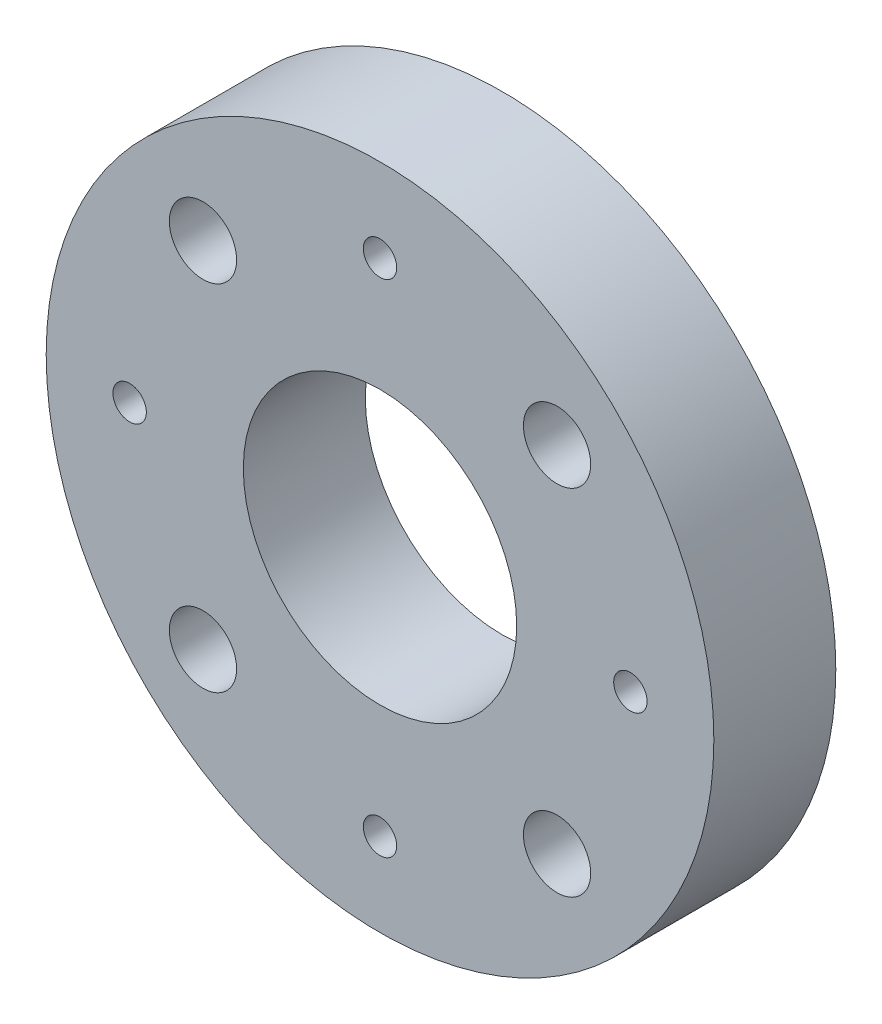
ISO-10303-21;
HEADER;
FILE_DESCRIPTION(('STEP AP214'),'2;1');
FILE_NAME('part.step','',(''),(''),'','','');
FILE_SCHEMA(('AUTOMOTIVE_DESIGN { 1 0 10303 214 1 1 1 1 }'));
ENDSEC;
DATA;
#1=APPLICATION_CONTEXT('core data for automotive mechanical design processes');
#2=APPLICATION_PROTOCOL_DEFINITION('international standard','automotive_design',2000,#1);
#3=PRODUCT_CONTEXT('',#1,'mechanical');
#4=PRODUCT('Part','Part','',(#3));
#5=PRODUCT_RELATED_PRODUCT_CATEGORY('part','',(#4));
#6=PRODUCT_DEFINITION_FORMATION('','',#4);
#7=PRODUCT_DEFINITION_CONTEXT('part definition',#1,'design');
#8=PRODUCT_DEFINITION('design','',#6,#7);
#9=PRODUCT_DEFINITION_SHAPE('','',#8);
#10=(LENGTH_UNIT() NAMED_UNIT(*) SI_UNIT(.MILLI.,.METRE.));
#11=(NAMED_UNIT(*) PLANE_ANGLE_UNIT() SI_UNIT($,.RADIAN.));
#12=(NAMED_UNIT(*) SI_UNIT($,.STERADIAN.) SOLID_ANGLE_UNIT());
#13=UNCERTAINTY_MEASURE_WITH_UNIT(LENGTH_MEASURE(1.E-05),#10,'distance_accuracy_value','');
#14=(GEOMETRIC_REPRESENTATION_CONTEXT(3) GLOBAL_UNCERTAINTY_ASSIGNED_CONTEXT((#13)) GLOBAL_UNIT_ASSIGNED_CONTEXT((#10,
#11,#12)) REPRESENTATION_CONTEXT('',''));
#15=CARTESIAN_POINT('',(0.,0.,0.));
#16=DIRECTION('',(0.,0.,1.));
#17=DIRECTION('',(1.,0.,0.));
#18=AXIS2_PLACEMENT_3D('',#15,#16,#17);
#19=CARTESIAN_POINT('',(0.,0.,5.8));
#20=DIRECTION('',(0.,0.,1.));
#21=DIRECTION('',(1.,0.,0.));
#22=AXIS2_PLACEMENT_3D('',#19,#20,#21);
#23=PLANE('',#22);
#24=CARTESIAN_POINT('',(-8.41899011350233,8.41899011350233,5.8));
#25=DIRECTION('',(0.,0.,1.));
#26=DIRECTION('',(1.,0.,0.));
#27=AXIS2_PLACEMENT_3D('',#24,#25,#26);
#28=CIRCLE('',#27,1.59999999999999);
#29=CARTESIAN_POINT('',(-6.81899011350234,8.41899011350233,5.8));
#30=VERTEX_POINT('',#29);
#31=EDGE_CURVE('E93',#30,#30,#28,.T.);
#32=ORIENTED_EDGE('',*,*,#31,.F.);
#33=EDGE_LOOP('',(#32));
#34=FACE_BOUND('',#33,.T.);
#35=CARTESIAN_POINT('',(8.41899011350233,8.41899011350233,5.8));
#36=DIRECTION('',(0.,0.,1.));
#37=DIRECTION('',(1.,0.,0.));
#38=AXIS2_PLACEMENT_3D('',#35,#36,#37);
#39=CIRCLE('',#38,1.59999999999999);
#40=CARTESIAN_POINT('',(10.0189901135023,8.41899011350233,5.8));
#41=VERTEX_POINT('',#40);
#42=EDGE_CURVE('E87',#41,#41,#39,.T.);
#43=ORIENTED_EDGE('',*,*,#42,.F.);
#44=EDGE_LOOP('',(#43));
#45=FACE_BOUND('',#44,.T.);
#46=CARTESIAN_POINT('',(8.41899011350233,-8.41899011350233,5.8));
#47=DIRECTION('',(0.,0.,1.));
#48=DIRECTION('',(1.,0.,0.));
#49=AXIS2_PLACEMENT_3D('',#46,#47,#48);
#50=CIRCLE('',#49,1.59999999999999);
#51=CARTESIAN_POINT('',(10.0189901135023,-8.41899011350233,5.8));
#52=VERTEX_POINT('',#51);
#53=EDGE_CURVE('E81',#52,#52,#50,.T.);
#54=ORIENTED_EDGE('',*,*,#53,.F.);
#55=EDGE_LOOP('',(#54));
#56=FACE_BOUND('',#55,.T.);
#57=CARTESIAN_POINT('',(-8.41899011350233,-8.41899011350233,5.8));
#58=DIRECTION('',(0.,0.,1.));
#59=DIRECTION('',(1.,0.,0.));
#60=AXIS2_PLACEMENT_3D('',#57,#58,#59);
#61=CIRCLE('',#60,1.59999999999999);
#62=CARTESIAN_POINT('',(-6.81899011350234,-8.41899011350233,5.8));
#63=VERTEX_POINT('',#62);
#64=EDGE_CURVE('E75',#63,#63,#61,.T.);
#65=ORIENTED_EDGE('',*,*,#64,.F.);
#66=EDGE_LOOP('',(#65));
#67=FACE_BOUND('',#66,.T.);
#68=CARTESIAN_POINT('',(0.,-11.90625,5.8));
#69=DIRECTION('',(0.,0.,1.));
#70=DIRECTION('',(1.,0.,0.));
#71=AXIS2_PLACEMENT_3D('',#68,#69,#70);
#72=CIRCLE('',#71,0.793749999999999);
#73=CARTESIAN_POINT('',(0.793750000000001,-11.90625,5.8));
#74=VERTEX_POINT('',#73);
#75=EDGE_CURVE('E58',#74,#74,#72,.T.);
#76=ORIENTED_EDGE('',*,*,#75,.F.);
#77=EDGE_LOOP('',(#76));
#78=FACE_BOUND('',#77,.T.);
#79=CARTESIAN_POINT('',(0.,11.90625,5.8));
#80=DIRECTION('',(0.,0.,1.));
#81=DIRECTION('',(1.,0.,0.));
#82=AXIS2_PLACEMENT_3D('',#79,#80,#81);
#83=CIRCLE('',#82,0.793749999999999);
#84=CARTESIAN_POINT('',(0.793749999999999,11.90625,5.8));
#85=VERTEX_POINT('',#84);
#86=EDGE_CURVE('E46',#85,#85,#83,.T.);
#87=ORIENTED_EDGE('',*,*,#86,.F.);
#88=EDGE_LOOP('',(#87));
#89=FACE_BOUND('',#88,.T.);
#90=CARTESIAN_POINT('',(0.,0.,5.8));
#91=DIRECTION('',(0.,0.,1.));
#92=DIRECTION('',(1.,0.,0.));
#93=AXIS2_PLACEMENT_3D('',#90,#91,#92);
#94=CIRCLE('',#93,15.875);
#95=CARTESIAN_POINT('',(15.875,0.,5.8));
#96=VERTEX_POINT('',#95);
#97=EDGE_CURVE('E10',#96,#96,#94,.T.);
#98=ORIENTED_EDGE('',*,*,#97,.T.);
#99=EDGE_LOOP('',(#98));
#100=FACE_BOUND('',#99,.T.);
#101=CARTESIAN_POINT('',(0.,0.,5.8));
#102=DIRECTION('',(0.,0.,1.));
#103=DIRECTION('',(1.,0.,0.));
#104=AXIS2_PLACEMENT_3D('',#101,#102,#103);
#105=CIRCLE('',#104,6.5);
#106=CARTESIAN_POINT('',(6.5,0.,5.8));
#107=VERTEX_POINT('',#106);
#108=EDGE_CURVE('E41',#107,#107,#105,.T.);
#109=ORIENTED_EDGE('',*,*,#108,.F.);
#110=EDGE_LOOP('',(#109));
#111=FACE_BOUND('',#110,.T.);
#112=CARTESIAN_POINT('',(-11.90625,0.,5.8));
#113=DIRECTION('',(0.,0.,1.));
#114=DIRECTION('',(1.,0.,0.));
#115=AXIS2_PLACEMENT_3D('',#112,#113,#114);
#116=CIRCLE('',#115,0.793749999999999);
#117=CARTESIAN_POINT('',(-11.1125,0.,5.8));
#118=VERTEX_POINT('',#117);
#119=EDGE_CURVE('E52',#118,#118,#116,.T.);
#120=ORIENTED_EDGE('',*,*,#119,.F.);
#121=EDGE_LOOP('',(#120));
#122=FACE_BOUND('',#121,.T.);
#123=CARTESIAN_POINT('',(11.90625,0.,5.8));
#124=DIRECTION('',(0.,0.,1.));
#125=DIRECTION('',(1.,0.,0.));
#126=AXIS2_PLACEMENT_3D('',#123,#124,#125);
#127=CIRCLE('',#126,0.793749999999999);
#128=CARTESIAN_POINT('',(12.7,0.,5.8));
#129=VERTEX_POINT('',#128);
#130=EDGE_CURVE('E64',#129,#129,#127,.T.);
#131=ORIENTED_EDGE('',*,*,#130,.F.);
#132=EDGE_LOOP('',(#131));
#133=FACE_BOUND('',#132,.T.);
#134=ADVANCED_FACE('F30',(#34,#45,#56,#67,#78,#89,#100,#111,#122,#133),#23,.T.);
#135=CARTESIAN_POINT('',(0.,0.,0.));
#136=DIRECTION('',(0.,0.,1.));
#137=DIRECTION('',(1.,0.,0.));
#138=AXIS2_PLACEMENT_3D('',#135,#136,#137);
#139=PLANE('',#138);
#140=CARTESIAN_POINT('',(-8.41899011350233,8.41899011350233,0.));
#141=DIRECTION('',(0.,0.,1.));
#142=DIRECTION('',(1.,0.,0.));
#143=AXIS2_PLACEMENT_3D('',#140,#141,#142);
#144=CIRCLE('',#143,1.59999999999999);
#145=CARTESIAN_POINT('',(-6.81899011350234,8.41899011350233,0.));
#146=VERTEX_POINT('',#145);
#147=EDGE_CURVE('E90',#146,#146,#144,.T.);
#148=ORIENTED_EDGE('',*,*,#147,.T.);
#149=EDGE_LOOP('',(#148));
#150=FACE_BOUND('',#149,.T.);
#151=CARTESIAN_POINT('',(8.41899011350233,8.41899011350233,0.));
#152=DIRECTION('',(0.,0.,1.));
#153=DIRECTION('',(1.,0.,0.));
#154=AXIS2_PLACEMENT_3D('',#151,#152,#153);
#155=CIRCLE('',#154,1.59999999999999);
#156=CARTESIAN_POINT('',(10.0189901135023,8.41899011350233,0.));
#157=VERTEX_POINT('',#156);
#158=EDGE_CURVE('E84',#157,#157,#155,.T.);
#159=ORIENTED_EDGE('',*,*,#158,.T.);
#160=EDGE_LOOP('',(#159));
#161=FACE_BOUND('',#160,.T.);
#162=CARTESIAN_POINT('',(8.41899011350233,-8.41899011350233,0.));
#163=DIRECTION('',(0.,0.,1.));
#164=DIRECTION('',(1.,0.,0.));
#165=AXIS2_PLACEMENT_3D('',#162,#163,#164);
#166=CIRCLE('',#165,1.59999999999999);
#167=CARTESIAN_POINT('',(10.0189901135023,-8.41899011350233,0.));
#168=VERTEX_POINT('',#167);
#169=EDGE_CURVE('E78',#168,#168,#166,.T.);
#170=ORIENTED_EDGE('',*,*,#169,.T.);
#171=EDGE_LOOP('',(#170));
#172=FACE_BOUND('',#171,.T.);
#173=CARTESIAN_POINT('',(-8.41899011350233,-8.41899011350233,0.));
#174=DIRECTION('',(0.,0.,1.));
#175=DIRECTION('',(1.,0.,0.));
#176=AXIS2_PLACEMENT_3D('',#173,#174,#175);
#177=CIRCLE('',#176,1.59999999999999);
#178=CARTESIAN_POINT('',(-6.81899011350234,-8.41899011350233,0.));
#179=VERTEX_POINT('',#178);
#180=EDGE_CURVE('E70',#179,#179,#177,.T.);
#181=ORIENTED_EDGE('',*,*,#180,.T.);
#182=EDGE_LOOP('',(#181));
#183=FACE_BOUND('',#182,.T.);
#184=CARTESIAN_POINT('',(0.,-11.90625,0.));
#185=DIRECTION('',(0.,0.,1.));
#186=DIRECTION('',(1.,0.,0.));
#187=AXIS2_PLACEMENT_3D('',#184,#185,#186);
#188=CIRCLE('',#187,0.793749999999999);
#189=CARTESIAN_POINT('',(0.793750000000001,-11.90625,0.));
#190=VERTEX_POINT('',#189);
#191=EDGE_CURVE('E61',#190,#190,#188,.T.);
#192=ORIENTED_EDGE('',*,*,#191,.T.);
#193=EDGE_LOOP('',(#192));
#194=FACE_BOUND('',#193,.T.);
#195=CARTESIAN_POINT('',(0.,11.90625,0.));
#196=DIRECTION('',(0.,0.,1.));
#197=DIRECTION('',(1.,0.,0.));
#198=AXIS2_PLACEMENT_3D('',#195,#196,#197);
#199=CIRCLE('',#198,0.793749999999999);
#200=CARTESIAN_POINT('',(0.793749999999999,11.90625,0.));
#201=VERTEX_POINT('',#200);
#202=EDGE_CURVE('E49',#201,#201,#199,.T.);
#203=ORIENTED_EDGE('',*,*,#202,.T.);
#204=EDGE_LOOP('',(#203));
#205=FACE_BOUND('',#204,.T.);
#206=CARTESIAN_POINT('',(0.,0.,0.));
#207=DIRECTION('',(0.,0.,1.));
#208=DIRECTION('',(1.,0.,0.));
#209=AXIS2_PLACEMENT_3D('',#206,#207,#208);
#210=CIRCLE('',#209,15.875);
#211=CARTESIAN_POINT('',(15.875,0.,0.));
#212=VERTEX_POINT('',#211);
#213=EDGE_CURVE('E34',#212,#212,#210,.T.);
#214=ORIENTED_EDGE('',*,*,#213,.F.);
#215=EDGE_LOOP('',(#214));
#216=FACE_BOUND('',#215,.T.);
#217=CARTESIAN_POINT('',(0.,0.,0.));
#218=DIRECTION('',(0.,0.,1.));
#219=DIRECTION('',(1.,0.,0.));
#220=AXIS2_PLACEMENT_3D('',#217,#218,#219);
#221=CIRCLE('',#220,6.5);
#222=CARTESIAN_POINT('',(6.5,0.,0.));
#223=VERTEX_POINT('',#222);
#224=EDGE_CURVE('E43',#223,#223,#221,.T.);
#225=ORIENTED_EDGE('',*,*,#224,.T.);
#226=EDGE_LOOP('',(#225));
#227=FACE_BOUND('',#226,.T.);
#228=CARTESIAN_POINT('',(-11.90625,0.,0.));
#229=DIRECTION('',(0.,0.,1.));
#230=DIRECTION('',(1.,0.,0.));
#231=AXIS2_PLACEMENT_3D('',#228,#229,#230);
#232=CIRCLE('',#231,0.793749999999999);
#233=CARTESIAN_POINT('',(-11.1125,0.,0.));
#234=VERTEX_POINT('',#233);
#235=EDGE_CURVE('E55',#234,#234,#232,.T.);
#236=ORIENTED_EDGE('',*,*,#235,.T.);
#237=EDGE_LOOP('',(#236));
#238=FACE_BOUND('',#237,.T.);
#239=CARTESIAN_POINT('',(11.90625,0.,0.));
#240=DIRECTION('',(0.,0.,1.));
#241=DIRECTION('',(1.,0.,0.));
#242=AXIS2_PLACEMENT_3D('',#239,#240,#241);
#243=CIRCLE('',#242,0.793749999999999);
#244=CARTESIAN_POINT('',(12.7,0.,0.));
#245=VERTEX_POINT('',#244);
#246=EDGE_CURVE('E67',#245,#245,#243,.T.);
#247=ORIENTED_EDGE('',*,*,#246,.T.);
#248=EDGE_LOOP('',(#247));
#249=FACE_BOUND('',#248,.T.);
#250=ADVANCED_FACE('F101',(#150,#161,#172,#183,#194,#205,#216,#227,#238,#249),#139,.F.);
#251=CARTESIAN_POINT('',(0.,0.,5.8));
#252=DIRECTION('',(0.,0.,-1.));
#253=DIRECTION('',(-1.,0.,0.));
#254=AXIS2_PLACEMENT_3D('',#251,#252,#253);
#255=CYLINDRICAL_SURFACE('',#254,15.875);
#256=ORIENTED_EDGE('',*,*,#97,.F.);
#257=EDGE_LOOP('',(#256));
#258=FACE_BOUND('',#257,.T.);
#259=ORIENTED_EDGE('',*,*,#213,.T.);
#260=EDGE_LOOP('',(#259));
#261=FACE_BOUND('',#260,.T.);
#262=ADVANCED_FACE('F32',(#258,#261),#255,.T.);
#263=CARTESIAN_POINT('',(0.,0.,5.8));
#264=DIRECTION('',(0.,0.,-1.));
#265=DIRECTION('',(-1.,0.,0.));
#266=AXIS2_PLACEMENT_3D('',#263,#264,#265);
#267=CYLINDRICAL_SURFACE('',#266,6.5);
#268=ORIENTED_EDGE('',*,*,#108,.T.);
#269=EDGE_LOOP('',(#268));
#270=FACE_BOUND('',#269,.T.);
#271=ORIENTED_EDGE('',*,*,#224,.F.);
#272=EDGE_LOOP('',(#271));
#273=FACE_BOUND('',#272,.T.);
#274=ADVANCED_FACE('F132',(#270,#273),#267,.F.);
#275=CARTESIAN_POINT('',(0.,11.90625,5.8));
#276=DIRECTION('',(0.,0.,-1.));
#277=DIRECTION('',(-1.,0.,0.));
#278=AXIS2_PLACEMENT_3D('',#275,#276,#277);
#279=CYLINDRICAL_SURFACE('',#278,0.793749999999999);
#280=ORIENTED_EDGE('',*,*,#86,.T.);
#281=EDGE_LOOP('',(#280));
#282=FACE_BOUND('',#281,.T.);
#283=ORIENTED_EDGE('',*,*,#202,.F.);
#284=EDGE_LOOP('',(#283));
#285=FACE_BOUND('',#284,.T.);
#286=ADVANCED_FACE('F138',(#282,#285),#279,.F.);
#287=CARTESIAN_POINT('',(-11.90625,0.,5.8));
#288=DIRECTION('',(0.,0.,-1.));
#289=DIRECTION('',(-1.,0.,0.));
#290=AXIS2_PLACEMENT_3D('',#287,#288,#289);
#291=CYLINDRICAL_SURFACE('',#290,0.793749999999999);
#292=ORIENTED_EDGE('',*,*,#119,.T.);
#293=EDGE_LOOP('',(#292));
#294=FACE_BOUND('',#293,.T.);
#295=ORIENTED_EDGE('',*,*,#235,.F.);
#296=EDGE_LOOP('',(#295));
#297=FACE_BOUND('',#296,.T.);
#298=ADVANCED_FACE('F142',(#294,#297),#291,.F.);
#299=CARTESIAN_POINT('',(0.,-11.90625,5.8));
#300=DIRECTION('',(0.,0.,-1.));
#301=DIRECTION('',(-1.,0.,0.));
#302=AXIS2_PLACEMENT_3D('',#299,#300,#301);
#303=CYLINDRICAL_SURFACE('',#302,0.793749999999999);
#304=ORIENTED_EDGE('',*,*,#75,.T.);
#305=EDGE_LOOP('',(#304));
#306=FACE_BOUND('',#305,.T.);
#307=ORIENTED_EDGE('',*,*,#191,.F.);
#308=EDGE_LOOP('',(#307));
#309=FACE_BOUND('',#308,.T.);
#310=ADVANCED_FACE('F123',(#306,#309),#303,.F.);
#311=CARTESIAN_POINT('',(11.90625,0.,5.8));
#312=DIRECTION('',(0.,0.,-1.));
#313=DIRECTION('',(-1.,0.,0.));
#314=AXIS2_PLACEMENT_3D('',#311,#312,#313);
#315=CYLINDRICAL_SURFACE('',#314,0.793749999999999);
#316=ORIENTED_EDGE('',*,*,#130,.T.);
#317=EDGE_LOOP('',(#316));
#318=FACE_BOUND('',#317,.T.);
#319=ORIENTED_EDGE('',*,*,#246,.F.);
#320=EDGE_LOOP('',(#319));
#321=FACE_BOUND('',#320,.T.);
#322=ADVANCED_FACE('F119',(#318,#321),#315,.F.);
#323=CARTESIAN_POINT('',(-8.41899011350233,-8.41899011350233,5.8));
#324=DIRECTION('',(0.,0.,1.));
#325=DIRECTION('',(1.,0.,0.));
#326=AXIS2_PLACEMENT_3D('',#323,#324,#325);
#327=CYLINDRICAL_SURFACE('',#326,1.59999999999999);
#328=ORIENTED_EDGE('',*,*,#180,.F.);
#329=EDGE_LOOP('',(#328));
#330=FACE_BOUND('',#329,.T.);
#331=ORIENTED_EDGE('',*,*,#64,.T.);
#332=EDGE_LOOP('',(#331));
#333=FACE_BOUND('',#332,.T.);
#334=ADVANCED_FACE('F122',(#330,#333),#327,.F.);
#335=CARTESIAN_POINT('',(8.41899011350233,-8.41899011350233,5.8));
#336=DIRECTION('',(0.,0.,1.));
#337=DIRECTION('',(1.,0.,0.));
#338=AXIS2_PLACEMENT_3D('',#335,#336,#337);
#339=CYLINDRICAL_SURFACE('',#338,1.59999999999999);
#340=ORIENTED_EDGE('',*,*,#169,.F.);
#341=EDGE_LOOP('',(#340));
#342=FACE_BOUND('',#341,.T.);
#343=ORIENTED_EDGE('',*,*,#53,.T.);
#344=EDGE_LOOP('',(#343));
#345=FACE_BOUND('',#344,.T.);
#346=ADVANCED_FACE('F152',(#342,#345),#339,.F.);
#347=CARTESIAN_POINT('',(8.41899011350233,8.41899011350233,5.8));
#348=DIRECTION('',(0.,0.,1.));
#349=DIRECTION('',(1.,0.,0.));
#350=AXIS2_PLACEMENT_3D('',#347,#348,#349);
#351=CYLINDRICAL_SURFACE('',#350,1.59999999999999);
#352=ORIENTED_EDGE('',*,*,#158,.F.);
#353=EDGE_LOOP('',(#352));
#354=FACE_BOUND('',#353,.T.);
#355=ORIENTED_EDGE('',*,*,#42,.T.);
#356=EDGE_LOOP('',(#355));
#357=FACE_BOUND('',#356,.T.);
#358=ADVANCED_FACE('F156',(#354,#357),#351,.F.);
#359=CARTESIAN_POINT('',(-8.41899011350233,8.41899011350233,5.8));
#360=DIRECTION('',(0.,0.,1.));
#361=DIRECTION('',(1.,0.,0.));
#362=AXIS2_PLACEMENT_3D('',#359,#360,#361);
#363=CYLINDRICAL_SURFACE('',#362,1.59999999999999);
#364=ORIENTED_EDGE('',*,*,#147,.F.);
#365=EDGE_LOOP('',(#364));
#366=FACE_BOUND('',#365,.T.);
#367=ORIENTED_EDGE('',*,*,#31,.T.);
#368=EDGE_LOOP('',(#367));
#369=FACE_BOUND('',#368,.T.);
#370=ADVANCED_FACE('F97',(#366,#369),#363,.F.);
#371=CLOSED_SHELL('',(#134,#250,#262,#274,#286,#298,#310,#322,#334,#346,#358,#370));
#372=MANIFOLD_SOLID_BREP('B2',#371);
#373=ADVANCED_BREP_SHAPE_REPRESENTATION('',(#18,#372),#14);
#374=SHAPE_DEFINITION_REPRESENTATION(#9,#373);
ENDSEC;
END-ISO-10303-21;
